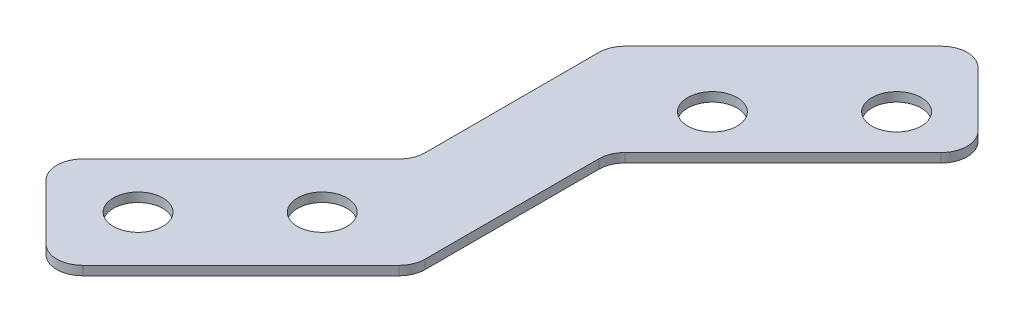
ISO-10303-21;
HEADER;
FILE_DESCRIPTION(('STEP AP214'),'2;1');
FILE_NAME('part.step','',(''),(''),'','','');
FILE_SCHEMA(('AUTOMOTIVE_DESIGN { 1 0 10303 214 1 1 1 1 }'));
ENDSEC;
DATA;
#1=APPLICATION_CONTEXT('core data for automotive mechanical design processes');
#2=APPLICATION_PROTOCOL_DEFINITION('international standard','automotive_design',2000,#1);
#3=PRODUCT_CONTEXT('',#1,'mechanical');
#4=PRODUCT('Part','Part','',(#3));
#5=PRODUCT_RELATED_PRODUCT_CATEGORY('part','',(#4));
#6=PRODUCT_DEFINITION_FORMATION('','',#4);
#7=PRODUCT_DEFINITION_CONTEXT('part definition',#1,'design');
#8=PRODUCT_DEFINITION('design','',#6,#7);
#9=PRODUCT_DEFINITION_SHAPE('','',#8);
#10=(LENGTH_UNIT() NAMED_UNIT(*) SI_UNIT(.MILLI.,.METRE.));
#11=(NAMED_UNIT(*) PLANE_ANGLE_UNIT() SI_UNIT($,.RADIAN.));
#12=(NAMED_UNIT(*) SI_UNIT($,.STERADIAN.) SOLID_ANGLE_UNIT());
#13=UNCERTAINTY_MEASURE_WITH_UNIT(LENGTH_MEASURE(1.E-05),#10,'distance_accuracy_value','');
#14=(GEOMETRIC_REPRESENTATION_CONTEXT(3) GLOBAL_UNCERTAINTY_ASSIGNED_CONTEXT((#13)) GLOBAL_UNIT_ASSIGNED_CONTEXT((#10,
#11,#12)) REPRESENTATION_CONTEXT('',''));
#15=CARTESIAN_POINT('',(0.,0.,0.));
#16=DIRECTION('',(0.,0.,1.));
#17=DIRECTION('',(1.,0.,0.));
#18=AXIS2_PLACEMENT_3D('',#15,#16,#17);
#19=CARTESIAN_POINT('',(-14.142135623731,-0.7,14.1421356237309));
#20=DIRECTION('',(0.707106781186547,0.,0.707106781186549));
#21=DIRECTION('',(0.707106781186549,0.,-0.707106781186547));
#22=AXIS2_PLACEMENT_3D('',#19,#20,#21);
#23=PLANE('',#22);
#24=DIRECTION('',(0.707106781186548,0.,-0.707106781186546));
#25=VECTOR('',#24,1.);
#26=CARTESIAN_POINT('',(-14.142135623731,-0.7,14.1421356237309));
#27=LINE('',#26,#25);
#28=CARTESIAN_POINT('',(-12.7279220613579,-0.7,12.7279220613578));
#29=VERTEX_POINT('',#28);
#30=CARTESIAN_POINT('',(-0.585786437626905,-0.7,0.585786437626903));
#31=VERTEX_POINT('',#30);
#32=EDGE_CURVE('E255',#29,#31,#27,.T.);
#33=ORIENTED_EDGE('',*,*,#32,.T.);
#34=DIRECTION('',(0.,1.,0.));
#35=VECTOR('',#34,1.);
#36=CARTESIAN_POINT('',(-0.585786437626903,-0.7,0.585786437626901));
#37=LINE('',#36,#35);
#38=CARTESIAN_POINT('',(-0.585786437626905,0.,0.585786437626903));
#39=VERTEX_POINT('',#38);
#40=EDGE_CURVE('E230',#31,#39,#37,.T.);
#41=ORIENTED_EDGE('',*,*,#40,.T.);
#42=DIRECTION('',(0.707106781186548,0.,-0.707106781186546));
#43=VECTOR('',#42,1.);
#44=CARTESIAN_POINT('',(-14.142135623731,0.,14.1421356237309));
#45=LINE('',#44,#43);
#46=CARTESIAN_POINT('',(-12.7279220613579,0.,12.7279220613578));
#47=VERTEX_POINT('',#46);
#48=EDGE_CURVE('E272',#47,#39,#45,.T.);
#49=ORIENTED_EDGE('',*,*,#48,.F.);
#50=DIRECTION('',(0.,1.,0.));
#51=VECTOR('',#50,1.);
#52=CARTESIAN_POINT('',(-12.7279220613579,-0.7,12.7279220613578));
#53=LINE('',#52,#51);
#54=EDGE_CURVE('E228',#47,#29,#53,.F.);
#55=ORIENTED_EDGE('',*,*,#54,.T.);
#56=EDGE_LOOP('',(#33,#41,#49,#55));
#57=FACE_BOUND('',#56,.T.);
#58=ADVANCED_FACE('F37',(#57),#23,.T.);
#59=CARTESIAN_POINT('',(-14.142135623731,-0.7,14.1421356237309));
#60=DIRECTION('',(-0.707106781186549,0.,0.707106781186547));
#61=DIRECTION('',(0.707106781186547,0.,0.707106781186549));
#62=AXIS2_PLACEMENT_3D('',#59,#60,#61);
#63=PLANE('',#62);
#64=DIRECTION('',(0.707106781186546,0.,0.707106781186548));
#65=VECTOR('',#64,1.);
#66=CARTESIAN_POINT('',(-14.142135623731,0.,14.1421356237309));
#67=LINE('',#66,#65);
#68=CARTESIAN_POINT('',(-19.7989898732233,0.,8.48528137423854));
#69=VERTEX_POINT('',#68);
#70=CARTESIAN_POINT('',(-15.5563491861041,0.,12.7279220613578));
#71=VERTEX_POINT('',#70);
#72=EDGE_CURVE('E184',#69,#71,#67,.T.);
#73=ORIENTED_EDGE('',*,*,#72,.F.);
#74=DIRECTION('',(0.,1.,0.));
#75=VECTOR('',#74,1.);
#76=CARTESIAN_POINT('',(-19.7989898732233,-0.7,8.48528137423854));
#77=LINE('',#76,#75);
#78=CARTESIAN_POINT('',(-19.7989898732233,-0.7,8.48528137423854));
#79=VERTEX_POINT('',#78);
#80=EDGE_CURVE('E236',#69,#79,#77,.F.);
#81=ORIENTED_EDGE('',*,*,#80,.T.);
#82=DIRECTION('',(0.707106781186546,0.,0.707106781186548));
#83=VECTOR('',#82,1.);
#84=CARTESIAN_POINT('',(-14.142135623731,-0.7,14.1421356237309));
#85=LINE('',#84,#83);
#86=CARTESIAN_POINT('',(-15.5563491861041,-0.7,12.7279220613578));
#87=VERTEX_POINT('',#86);
#88=EDGE_CURVE('E176',#79,#87,#85,.T.);
#89=ORIENTED_EDGE('',*,*,#88,.T.);
#90=DIRECTION('',(0.,1.,0.));
#91=VECTOR('',#90,1.);
#92=CARTESIAN_POINT('',(-15.5563491861041,-0.7,12.7279220613578));
#93=LINE('',#92,#91);
#94=EDGE_CURVE('E233',#87,#71,#93,.T.);
#95=ORIENTED_EDGE('',*,*,#94,.T.);
#96=EDGE_LOOP('',(#73,#81,#89,#95));
#97=FACE_BOUND('',#96,.T.);
#98=ADVANCED_FACE('F289',(#97),#63,.T.);
#99=CARTESIAN_POINT('',(-7.07106781186548,-0.7,-7.07106781186546));
#100=DIRECTION('',(-0.707106781186547,0.,-0.707106781186548));
#101=DIRECTION('',(-0.707106781186548,0.,0.707106781186547));
#102=AXIS2_PLACEMENT_3D('',#99,#100,#101);
#103=PLANE('',#102);
#104=DIRECTION('',(-0.707106781186549,0.,0.707106781186547));
#105=VECTOR('',#104,1.);
#106=CARTESIAN_POINT('',(-7.07106781186548,0.,-7.07106781186546));
#107=LINE('',#106,#105);
#108=CARTESIAN_POINT('',(-7.65685424949239,0.,-6.48528137423856));
#109=VERTEX_POINT('',#108);
#110=CARTESIAN_POINT('',(-19.7989898732233,0.,5.65685424949236));
#111=VERTEX_POINT('',#110);
#112=EDGE_CURVE('E281',#109,#111,#107,.T.);
#113=ORIENTED_EDGE('',*,*,#112,.F.);
#114=DIRECTION('',(0.,1.,0.));
#115=VECTOR('',#114,1.);
#116=CARTESIAN_POINT('',(-7.65685424949239,-0.7,-6.48528137423856));
#117=LINE('',#116,#115);
#118=CARTESIAN_POINT('',(-7.65685424949239,-0.7,-6.48528137423856));
#119=VERTEX_POINT('',#118);
#120=EDGE_CURVE('E222',#109,#119,#117,.F.);
#121=ORIENTED_EDGE('',*,*,#120,.T.);
#122=DIRECTION('',(-0.707106781186549,0.,0.707106781186547));
#123=VECTOR('',#122,1.);
#124=CARTESIAN_POINT('',(-7.07106781186548,-0.7,-7.07106781186546));
#125=LINE('',#124,#123);
#126=CARTESIAN_POINT('',(-19.7989898732233,-0.7,5.65685424949236));
#127=VERTEX_POINT('',#126);
#128=EDGE_CURVE('E181',#119,#127,#125,.T.);
#129=ORIENTED_EDGE('',*,*,#128,.T.);
#130=DIRECTION('',(0.,1.,0.));
#131=VECTOR('',#130,1.);
#132=CARTESIAN_POINT('',(-19.7989898732233,-0.7,5.65685424949236));
#133=LINE('',#132,#131);
#134=EDGE_CURVE('E219',#127,#111,#133,.T.);
#135=ORIENTED_EDGE('',*,*,#134,.T.);
#136=EDGE_LOOP('',(#113,#121,#129,#135));
#137=FACE_BOUND('',#136,.T.);
#138=ADVANCED_FACE('F301',(#137),#103,.T.);
#139=CARTESIAN_POINT('',(-7.07106781186552,-0.7,-22.0710678118655));
#140=DIRECTION('',(-1.,0.,0.));
#141=DIRECTION('',(0.,0.,1.));
#142=AXIS2_PLACEMENT_3D('',#139,#140,#141);
#143=PLANE('',#142);
#144=DIRECTION('',(0.,0.,1.));
#145=VECTOR('',#144,1.);
#146=CARTESIAN_POINT('',(-7.07106781186552,-0.7,-22.0710678118655));
#147=LINE('',#146,#145);
#148=CARTESIAN_POINT('',(-7.07106781186551,-0.7,-21.2426406871193));
#149=VERTEX_POINT('',#148);
#150=CARTESIAN_POINT('',(-7.07106781186548,-0.7,-7.89949493661166));
#151=VERTEX_POINT('',#150);
#152=EDGE_CURVE('E267',#149,#151,#147,.T.);
#153=ORIENTED_EDGE('',*,*,#152,.T.);
#154=DIRECTION('',(0.,1.,0.));
#155=VECTOR('',#154,1.);
#156=CARTESIAN_POINT('',(-7.07106781186548,0.,-7.89949493661166));
#157=LINE('',#156,#155);
#158=CARTESIAN_POINT('',(-7.07106781186548,0.,-7.89949493661166));
#159=VERTEX_POINT('',#158);
#160=EDGE_CURVE('E216',#151,#159,#157,.T.);
#161=ORIENTED_EDGE('',*,*,#160,.T.);
#162=DIRECTION('',(0.,0.,1.));
#163=VECTOR('',#162,1.);
#164=CARTESIAN_POINT('',(-7.07106781186552,0.,-22.0710678118655));
#165=LINE('',#164,#163);
#166=CARTESIAN_POINT('',(-7.07106781186551,0.,-21.2426406871193));
#167=VERTEX_POINT('',#166);
#168=EDGE_CURVE('E279',#167,#159,#165,.T.);
#169=ORIENTED_EDGE('',*,*,#168,.F.);
#170=DIRECTION('',(0.,1.,0.));
#171=VECTOR('',#170,1.);
#172=CARTESIAN_POINT('',(-7.07106781186551,-0.7,-21.2426406871193));
#173=LINE('',#172,#171);
#174=EDGE_CURVE('E214',#167,#149,#173,.F.);
#175=ORIENTED_EDGE('',*,*,#174,.T.);
#176=EDGE_LOOP('',(#153,#161,#169,#175));
#177=FACE_BOUND('',#176,.T.);
#178=ADVANCED_FACE('F309',(#177),#143,.T.);
#179=CARTESIAN_POINT('',(7.07106781186552,-0.7,-36.2132034355964));
#180=DIRECTION('',(-0.707106781186543,0.,-0.707106781186552));
#181=DIRECTION('',(-0.707106781186552,0.,0.707106781186543));
#182=AXIS2_PLACEMENT_3D('',#179,#180,#181);
#183=PLANE('',#182);
#184=DIRECTION('',(-0.707106781186552,0.,0.707106781186543));
#185=VECTOR('',#184,1.);
#186=CARTESIAN_POINT('',(7.07106781186552,0.,-36.2132034355964));
#187=LINE('',#186,#185);
#188=CARTESIAN_POINT('',(5.65685424949242,0.,-34.7989898732233));
#189=VERTEX_POINT('',#188);
#190=CARTESIAN_POINT('',(-6.4852813742386,0.,-22.6568542494925));
#191=VERTEX_POINT('',#190);
#192=EDGE_CURVE('E171',#189,#191,#187,.T.);
#193=ORIENTED_EDGE('',*,*,#192,.F.);
#194=DIRECTION('',(0.,1.,0.));
#195=VECTOR('',#194,1.);
#196=CARTESIAN_POINT('',(5.65685424949242,-0.7,-34.7989898732233));
#197=LINE('',#196,#195);
#198=CARTESIAN_POINT('',(5.65685424949242,-0.7,-34.7989898732233));
#199=VERTEX_POINT('',#198);
#200=EDGE_CURVE('E197',#189,#199,#197,.F.);
#201=ORIENTED_EDGE('',*,*,#200,.T.);
#202=DIRECTION('',(-0.707106781186552,0.,0.707106781186543));
#203=VECTOR('',#202,1.);
#204=CARTESIAN_POINT('',(7.07106781186552,-0.7,-36.2132034355964));
#205=LINE('',#204,#203);
#206=CARTESIAN_POINT('',(-6.4852813742386,-0.7,-22.6568542494925));
#207=VERTEX_POINT('',#206);
#208=EDGE_CURVE('E264',#199,#207,#205,.T.);
#209=ORIENTED_EDGE('',*,*,#208,.T.);
#210=DIRECTION('',(0.,1.,0.));
#211=VECTOR('',#210,1.);
#212=CARTESIAN_POINT('',(-6.4852813742386,-0.7,-22.6568542494925));
#213=LINE('',#212,#211);
#214=EDGE_CURVE('E194',#207,#191,#213,.T.);
#215=ORIENTED_EDGE('',*,*,#214,.T.);
#216=EDGE_LOOP('',(#193,#201,#209,#215));
#217=FACE_BOUND('',#216,.T.);
#218=ADVANCED_FACE('F318',(#217),#183,.T.);
#219=CARTESIAN_POINT('',(14.142135623731,-0.7,-29.1421356237309));
#220=DIRECTION('',(0.707106781186549,0.,-0.707106781186546));
#221=DIRECTION('',(-0.707106781186546,0.,-0.707106781186549));
#222=AXIS2_PLACEMENT_3D('',#219,#220,#221);
#223=PLANE('',#222);
#224=DIRECTION('',(-0.707106781186546,0.,-0.707106781186549));
#225=VECTOR('',#224,1.);
#226=CARTESIAN_POINT('',(14.142135623731,-0.7,-29.1421356237309));
#227=LINE('',#226,#225);
#228=CARTESIAN_POINT('',(12.7279220613579,-0.7,-30.556349186104));
#229=VERTEX_POINT('',#228);
#230=CARTESIAN_POINT('',(8.4852813742386,-0.7,-34.7989898732233));
#231=VERTEX_POINT('',#230);
#232=EDGE_CURVE('E257',#229,#231,#227,.T.);
#233=ORIENTED_EDGE('',*,*,#232,.T.);
#234=DIRECTION('',(0.,1.,0.));
#235=VECTOR('',#234,1.);
#236=CARTESIAN_POINT('',(8.48528137423861,-0.7,-34.7989898732233));
#237=LINE('',#236,#235);
#238=CARTESIAN_POINT('',(8.4852813742386,0.,-34.7989898732233));
#239=VERTEX_POINT('',#238);
#240=EDGE_CURVE('E170',#231,#239,#237,.T.);
#241=ORIENTED_EDGE('',*,*,#240,.T.);
#242=DIRECTION('',(-0.707106781186546,0.,-0.707106781186549));
#243=VECTOR('',#242,1.);
#244=CARTESIAN_POINT('',(14.142135623731,0.,-29.1421356237309));
#245=LINE('',#244,#243);
#246=CARTESIAN_POINT('',(12.7279220613579,0.,-30.556349186104));
#247=VERTEX_POINT('',#246);
#248=EDGE_CURVE('E153',#247,#239,#245,.T.);
#249=ORIENTED_EDGE('',*,*,#248,.F.);
#250=DIRECTION('',(0.,1.,0.));
#251=VECTOR('',#250,1.);
#252=CARTESIAN_POINT('',(12.7279220613579,-0.7,-30.556349186104));
#253=LINE('',#252,#251);
#254=EDGE_CURVE('E167',#247,#229,#253,.F.);
#255=ORIENTED_EDGE('',*,*,#254,.T.);
#256=EDGE_LOOP('',(#233,#241,#249,#255));
#257=FACE_BOUND('',#256,.T.);
#258=ADVANCED_FACE('F166',(#257),#223,.T.);
#259=CARTESIAN_POINT('',(0.,-0.7,-15.));
#260=DIRECTION('',(0.707106781186547,0.,0.707106781186549));
#261=DIRECTION('',(0.707106781186549,0.,-0.707106781186547));
#262=AXIS2_PLACEMENT_3D('',#259,#260,#261);
#263=PLANE('',#262);
#264=DIRECTION('',(0.707106781186549,0.,-0.707106781186546));
#265=VECTOR('',#264,1.);
#266=CARTESIAN_POINT('',(0.,-0.7,-15.));
#267=LINE('',#266,#265);
#268=CARTESIAN_POINT('',(0.585786437626906,-0.7,-15.5857864376269));
#269=VERTEX_POINT('',#268);
#270=CARTESIAN_POINT('',(12.7279220613579,-0.7,-27.7279220613578));
#271=VERTEX_POINT('',#270);
#272=EDGE_CURVE('E254',#269,#271,#267,.T.);
#273=ORIENTED_EDGE('',*,*,#272,.T.);
#274=DIRECTION('',(0.,1.,0.));
#275=VECTOR('',#274,1.);
#276=CARTESIAN_POINT('',(12.7279220613579,-0.7,-27.7279220613578));
#277=LINE('',#276,#275);
#278=CARTESIAN_POINT('',(12.7279220613579,0.,-27.7279220613578));
#279=VERTEX_POINT('',#278);
#280=EDGE_CURVE('E212',#271,#279,#277,.T.);
#281=ORIENTED_EDGE('',*,*,#280,.T.);
#282=DIRECTION('',(0.707106781186549,0.,-0.707106781186546));
#283=VECTOR('',#282,1.);
#284=CARTESIAN_POINT('',(0.,0.,-15.));
#285=LINE('',#284,#283);
#286=CARTESIAN_POINT('',(0.585786437626906,0.,-15.5857864376269));
#287=VERTEX_POINT('',#286);
#288=EDGE_CURVE('E155',#287,#279,#285,.T.);
#289=ORIENTED_EDGE('',*,*,#288,.F.);
#290=DIRECTION('',(0.,1.,0.));
#291=VECTOR('',#290,1.);
#292=CARTESIAN_POINT('',(0.585786437626907,-0.7,-15.5857864376269));
#293=LINE('',#292,#291);
#294=EDGE_CURVE('E210',#287,#269,#293,.F.);
#295=ORIENTED_EDGE('',*,*,#294,.T.);
#296=EDGE_LOOP('',(#273,#281,#289,#295));
#297=FACE_BOUND('',#296,.T.);
#298=ADVANCED_FACE('F248',(#297),#263,.T.);
#299=CARTESIAN_POINT('',(0.,-0.7,0.));
#300=DIRECTION('',(1.,0.,0.));
#301=DIRECTION('',(0.,0.,-1.));
#302=AXIS2_PLACEMENT_3D('',#299,#300,#301);
#303=PLANE('',#302);
#304=DIRECTION('',(0.,0.,-1.));
#305=VECTOR('',#304,1.);
#306=CARTESIAN_POINT('',(0.,-0.7,0.));
#307=LINE('',#306,#305);
#308=CARTESIAN_POINT('',(0.,-0.7,-0.828427124746194));
#309=VERTEX_POINT('',#308);
#310=CARTESIAN_POINT('',(0.,-0.7,-14.1715728752538));
#311=VERTEX_POINT('',#310);
#312=EDGE_CURVE('E252',#309,#311,#307,.T.);
#313=ORIENTED_EDGE('',*,*,#312,.T.);
#314=DIRECTION('',(0.,1.,0.));
#315=VECTOR('',#314,1.);
#316=CARTESIAN_POINT('',(0.,0.,-14.1715728752538));
#317=LINE('',#316,#315);
#318=CARTESIAN_POINT('',(0.,0.,-14.1715728752538));
#319=VERTEX_POINT('',#318);
#320=EDGE_CURVE('E225',#311,#319,#317,.T.);
#321=ORIENTED_EDGE('',*,*,#320,.T.);
#322=DIRECTION('',(0.,0.,-1.));
#323=VECTOR('',#322,1.);
#324=CARTESIAN_POINT('',(0.,0.,0.));
#325=LINE('',#324,#323);
#326=CARTESIAN_POINT('',(0.,0.,-0.828427124746194));
#327=VERTEX_POINT('',#326);
#328=EDGE_CURVE('E242',#327,#319,#325,.T.);
#329=ORIENTED_EDGE('',*,*,#328,.F.);
#330=DIRECTION('',(0.,1.,0.));
#331=VECTOR('',#330,1.);
#332=CARTESIAN_POINT('',(0.,-0.7,-0.828427124746194));
#333=LINE('',#332,#331);
#334=EDGE_CURVE('E57',#327,#309,#333,.F.);
#335=ORIENTED_EDGE('',*,*,#334,.T.);
#336=EDGE_LOOP('',(#313,#321,#329,#335));
#337=FACE_BOUND('',#336,.T.);
#338=ADVANCED_FACE('F251',(#337),#303,.T.);
#339=CARTESIAN_POINT('',(0.,-0.7,0.));
#340=DIRECTION('',(0.,1.,0.));
#341=DIRECTION('',(0.,0.,1.));
#342=AXIS2_PLACEMENT_3D('',#339,#340,#341);
#343=PLANE('',#342);
#344=CARTESIAN_POINT('',(-14.1398215405069,-0.699999999999999,7.07338189508951));
#345=DIRECTION('',(0.,1.,0.));
#346=DIRECTION('',(0.,0.,1.));
#347=AXIS2_PLACEMENT_3D('',#344,#345,#346);
#348=CIRCLE('',#347,1.89864999999999);
#349=CARTESIAN_POINT('',(-14.1398215405069,-0.699999999999999,8.9720318950895));
#350=VERTEX_POINT('',#349);
#351=EDGE_CURVE('E379',#350,#350,#348,.T.);
#352=ORIENTED_EDGE('',*,*,#351,.T.);
#353=EDGE_LOOP('',(#352));
#354=FACE_BOUND('',#353,.T.);
#355=CARTESIAN_POINT('',(-7.06875372864142,-0.699999999999999,0.00231408322403509));
#356=DIRECTION('',(0.,1.,0.));
#357=DIRECTION('',(0.,0.,1.));
#358=AXIS2_PLACEMENT_3D('',#355,#356,#357);
#359=CIRCLE('',#358,1.89864999999999);
#360=CARTESIAN_POINT('',(-7.06875372864142,-0.699999999999999,1.90096408322403));
#361=VERTEX_POINT('',#360);
#362=EDGE_CURVE('E374',#361,#361,#359,.T.);
#363=ORIENTED_EDGE('',*,*,#362,.T.);
#364=EDGE_LOOP('',(#363));
#365=FACE_BOUND('',#364,.T.);
#366=CARTESIAN_POINT('',(1.23743686707646,-0.699999999999999,-21.6538748109654));
#367=DIRECTION('',(0.,1.,0.));
#368=DIRECTION('',(0.,0.,1.));
#369=AXIS2_PLACEMENT_3D('',#366,#367,#368);
#370=CIRCLE('',#369,1.89864999999999);
#371=CARTESIAN_POINT('',(1.23743686707646,-0.699999999999999,-19.7552248109654));
#372=VERTEX_POINT('',#371);
#373=EDGE_CURVE('E390',#372,#372,#370,.T.);
#374=ORIENTED_EDGE('',*,*,#373,.T.);
#375=EDGE_LOOP('',(#374));
#376=FACE_BOUND('',#375,.T.);
#377=CARTESIAN_POINT('',(8.30850467894193,-0.699999999999999,-28.7249426228309));
#378=DIRECTION('',(0.,1.,0.));
#379=DIRECTION('',(0.,0.,1.));
#380=AXIS2_PLACEMENT_3D('',#377,#378,#379);
#381=CIRCLE('',#380,1.89864999999999);
#382=CARTESIAN_POINT('',(8.30850467894193,-0.699999999999999,-26.8262926228309));
#383=VERTEX_POINT('',#382);
#384=EDGE_CURVE('E275',#383,#383,#381,.T.);
#385=ORIENTED_EDGE('',*,*,#384,.T.);
#386=EDGE_LOOP('',(#385));
#387=FACE_BOUND('',#386,.T.);
#388=ORIENTED_EDGE('',*,*,#208,.F.);
#389=CARTESIAN_POINT('',(7.07106781186551,-0.7,-33.3847763108502));
#390=DIRECTION('',(0.,1.,0.));
#391=DIRECTION('',(0.,0.,1.));
#392=AXIS2_PLACEMENT_3D('',#389,#390,#391);
#393=CIRCLE('',#392,2.);
#394=EDGE_CURVE('E208',#199,#231,#393,.F.);
#395=ORIENTED_EDGE('',*,*,#394,.T.);
#396=ORIENTED_EDGE('',*,*,#232,.F.);
#397=CARTESIAN_POINT('',(11.3137084989848,-0.7,-29.1421356237309));
#398=DIRECTION('',(0.,1.,0.));
#399=DIRECTION('',(0.,0.,1.));
#400=AXIS2_PLACEMENT_3D('',#397,#398,#399);
#401=CIRCLE('',#400,2.);
#402=EDGE_CURVE('E175',#229,#271,#401,.F.);
#403=ORIENTED_EDGE('',*,*,#402,.T.);
#404=ORIENTED_EDGE('',*,*,#272,.F.);
#405=CARTESIAN_POINT('',(2.,-0.7,-14.1715728752538));
#406=DIRECTION('',(0.,1.,0.));
#407=DIRECTION('',(0.,0.,1.));
#408=AXIS2_PLACEMENT_3D('',#405,#406,#407);
#409=CIRCLE('',#408,2.);
#410=EDGE_CURVE('E11',#269,#311,#409,.T.);
#411=ORIENTED_EDGE('',*,*,#410,.T.);
#412=ORIENTED_EDGE('',*,*,#312,.F.);
#413=CARTESIAN_POINT('',(-2.,-0.7,-0.828427124746194));
#414=DIRECTION('',(0.,1.,0.));
#415=DIRECTION('',(0.,0.,1.));
#416=AXIS2_PLACEMENT_3D('',#413,#414,#415);
#417=CIRCLE('',#416,2.);
#418=EDGE_CURVE('E203',#309,#31,#417,.F.);
#419=ORIENTED_EDGE('',*,*,#418,.T.);
#420=ORIENTED_EDGE('',*,*,#32,.F.);
#421=CARTESIAN_POINT('',(-14.142135623731,-0.7,11.3137084989847));
#422=DIRECTION('',(0.,1.,0.));
#423=DIRECTION('',(0.,0.,1.));
#424=AXIS2_PLACEMENT_3D('',#421,#422,#423);
#425=CIRCLE('',#424,2.);
#426=EDGE_CURVE('E199',#29,#87,#425,.F.);
#427=ORIENTED_EDGE('',*,*,#426,.T.);
#428=ORIENTED_EDGE('',*,*,#88,.F.);
#429=CARTESIAN_POINT('',(-18.3847763108502,-0.7,7.07106781186545));
#430=DIRECTION('',(0.,1.,0.));
#431=DIRECTION('',(0.,0.,1.));
#432=AXIS2_PLACEMENT_3D('',#429,#430,#431);
#433=CIRCLE('',#432,2.);
#434=EDGE_CURVE('E201',#79,#127,#433,.F.);
#435=ORIENTED_EDGE('',*,*,#434,.T.);
#436=ORIENTED_EDGE('',*,*,#128,.F.);
#437=CARTESIAN_POINT('',(-9.07106781186548,-0.7,-7.89949493661165));
#438=DIRECTION('',(0.,1.,0.));
#439=DIRECTION('',(0.,0.,1.));
#440=AXIS2_PLACEMENT_3D('',#437,#438,#439);
#441=CIRCLE('',#440,2.);
#442=EDGE_CURVE('E240',#119,#151,#441,.T.);
#443=ORIENTED_EDGE('',*,*,#442,.T.);
#444=ORIENTED_EDGE('',*,*,#152,.F.);
#445=CARTESIAN_POINT('',(-5.07106781186552,-0.7,-21.2426406871193));
#446=DIRECTION('',(0.,1.,0.));
#447=DIRECTION('',(0.,0.,1.));
#448=AXIS2_PLACEMENT_3D('',#445,#446,#447);
#449=CIRCLE('',#448,2.);
#450=EDGE_CURVE('E205',#149,#207,#449,.F.);
#451=ORIENTED_EDGE('',*,*,#450,.T.);
#452=EDGE_LOOP('',(#388,#395,#396,#403,#404,#411,#412,#419,#420,#427,#428,#435,#436,#443,#444,#451));
#453=FACE_BOUND('',#452,.T.);
#454=ADVANCED_FACE('F298',(#354,#365,#376,#387,#453),#343,.F.);
#455=CARTESIAN_POINT('',(0.,0.,0.));
#456=DIRECTION('',(0.,1.,0.));
#457=DIRECTION('',(0.,0.,1.));
#458=AXIS2_PLACEMENT_3D('',#455,#456,#457);
#459=PLANE('',#458);
#460=CARTESIAN_POINT('',(-14.1398215405069,0.,7.07338189508951));
#461=DIRECTION('',(0.,1.,0.));
#462=DIRECTION('',(0.,0.,1.));
#463=AXIS2_PLACEMENT_3D('',#460,#461,#462);
#464=CIRCLE('',#463,1.89864999999999);
#465=CARTESIAN_POINT('',(-14.1398215405069,0.,8.9720318950895));
#466=VERTEX_POINT('',#465);
#467=EDGE_CURVE('E384',#466,#466,#464,.T.);
#468=ORIENTED_EDGE('',*,*,#467,.F.);
#469=EDGE_LOOP('',(#468));
#470=FACE_BOUND('',#469,.T.);
#471=CARTESIAN_POINT('',(-7.06875372864142,0.,0.00231408322403509));
#472=DIRECTION('',(0.,1.,0.));
#473=DIRECTION('',(0.,0.,1.));
#474=AXIS2_PLACEMENT_3D('',#471,#472,#473);
#475=CIRCLE('',#474,1.89864999999999);
#476=CARTESIAN_POINT('',(-7.06875372864142,0.,1.90096408322402));
#477=VERTEX_POINT('',#476);
#478=EDGE_CURVE('E377',#477,#477,#475,.T.);
#479=ORIENTED_EDGE('',*,*,#478,.F.);
#480=EDGE_LOOP('',(#479));
#481=FACE_BOUND('',#480,.T.);
#482=CARTESIAN_POINT('',(1.23743686707646,0.,-21.6538748109654));
#483=DIRECTION('',(0.,1.,0.));
#484=DIRECTION('',(0.,0.,1.));
#485=AXIS2_PLACEMENT_3D('',#482,#483,#484);
#486=CIRCLE('',#485,1.89864999999999);
#487=CARTESIAN_POINT('',(1.23743686707646,0.,-19.7552248109654));
#488=VERTEX_POINT('',#487);
#489=EDGE_CURVE('E381',#488,#488,#486,.T.);
#490=ORIENTED_EDGE('',*,*,#489,.F.);
#491=EDGE_LOOP('',(#490));
#492=FACE_BOUND('',#491,.T.);
#493=CARTESIAN_POINT('',(8.30850467894193,0.,-28.7249426228309));
#494=DIRECTION('',(0.,1.,0.));
#495=DIRECTION('',(0.,0.,1.));
#496=AXIS2_PLACEMENT_3D('',#493,#494,#495);
#497=CIRCLE('',#496,1.89864999999999);
#498=CARTESIAN_POINT('',(8.30850467894193,0.,-26.8262926228309));
#499=VERTEX_POINT('',#498);
#500=EDGE_CURVE('E393',#499,#499,#497,.T.);
#501=ORIENTED_EDGE('',*,*,#500,.F.);
#502=EDGE_LOOP('',(#501));
#503=FACE_BOUND('',#502,.T.);
#504=ORIENTED_EDGE('',*,*,#248,.T.);
#505=CARTESIAN_POINT('',(7.07106781186551,0.,-33.3847763108502));
#506=DIRECTION('',(0.,1.,0.));
#507=DIRECTION('',(0.,0.,1.));
#508=AXIS2_PLACEMENT_3D('',#505,#506,#507);
#509=CIRCLE('',#508,2.);
#510=EDGE_CURVE('E160',#239,#189,#509,.T.);
#511=ORIENTED_EDGE('',*,*,#510,.T.);
#512=ORIENTED_EDGE('',*,*,#192,.T.);
#513=CARTESIAN_POINT('',(-5.07106781186552,0.,-21.2426406871193));
#514=DIRECTION('',(0.,1.,0.));
#515=DIRECTION('',(0.,0.,1.));
#516=AXIS2_PLACEMENT_3D('',#513,#514,#515);
#517=CIRCLE('',#516,2.);
#518=EDGE_CURVE('E161',#191,#167,#517,.T.);
#519=ORIENTED_EDGE('',*,*,#518,.T.);
#520=ORIENTED_EDGE('',*,*,#168,.T.);
#521=CARTESIAN_POINT('',(-9.07106781186548,0.,-7.89949493661165));
#522=DIRECTION('',(0.,1.,0.));
#523=DIRECTION('',(0.,0.,1.));
#524=AXIS2_PLACEMENT_3D('',#521,#522,#523);
#525=CIRCLE('',#524,2.);
#526=EDGE_CURVE('E238',#159,#109,#525,.F.);
#527=ORIENTED_EDGE('',*,*,#526,.T.);
#528=ORIENTED_EDGE('',*,*,#112,.T.);
#529=CARTESIAN_POINT('',(-18.3847763108502,0.,7.07106781186545));
#530=DIRECTION('',(0.,1.,0.));
#531=DIRECTION('',(0.,0.,1.));
#532=AXIS2_PLACEMENT_3D('',#529,#530,#531);
#533=CIRCLE('',#532,2.);
#534=EDGE_CURVE('E188',#111,#69,#533,.T.);
#535=ORIENTED_EDGE('',*,*,#534,.T.);
#536=ORIENTED_EDGE('',*,*,#72,.T.);
#537=CARTESIAN_POINT('',(-14.142135623731,0.,11.3137084989847));
#538=DIRECTION('',(0.,1.,0.));
#539=DIRECTION('',(0.,0.,1.));
#540=AXIS2_PLACEMENT_3D('',#537,#538,#539);
#541=CIRCLE('',#540,2.);
#542=EDGE_CURVE('E178',#71,#47,#541,.T.);
#543=ORIENTED_EDGE('',*,*,#542,.T.);
#544=ORIENTED_EDGE('',*,*,#48,.T.);
#545=CARTESIAN_POINT('',(-2.,0.,-0.828427124746194));
#546=DIRECTION('',(0.,1.,0.));
#547=DIRECTION('',(0.,0.,1.));
#548=AXIS2_PLACEMENT_3D('',#545,#546,#547);
#549=CIRCLE('',#548,2.);
#550=EDGE_CURVE('E190',#39,#327,#549,.T.);
#551=ORIENTED_EDGE('',*,*,#550,.T.);
#552=ORIENTED_EDGE('',*,*,#328,.T.);
#553=CARTESIAN_POINT('',(2.,0.,-14.1715728752538));
#554=DIRECTION('',(0.,1.,0.));
#555=DIRECTION('',(0.,0.,1.));
#556=AXIS2_PLACEMENT_3D('',#553,#554,#555);
#557=CIRCLE('',#556,2.);
#558=EDGE_CURVE('E45',#319,#287,#557,.F.);
#559=ORIENTED_EDGE('',*,*,#558,.T.);
#560=ORIENTED_EDGE('',*,*,#288,.T.);
#561=CARTESIAN_POINT('',(11.3137084989848,0.,-29.1421356237309));
#562=DIRECTION('',(0.,1.,0.));
#563=DIRECTION('',(0.,0.,1.));
#564=AXIS2_PLACEMENT_3D('',#561,#562,#563);
#565=CIRCLE('',#564,2.);
#566=EDGE_CURVE('E150',#279,#247,#565,.T.);
#567=ORIENTED_EDGE('',*,*,#566,.T.);
#568=EDGE_LOOP('',(#504,#511,#512,#519,#520,#527,#528,#535,#536,#543,#544,#551,#552,#559,#560,#567));
#569=FACE_BOUND('',#568,.T.);
#570=ADVANCED_FACE('F152',(#470,#481,#492,#503,#569),#459,.T.);
#571=CARTESIAN_POINT('',(8.30850467894193,0.,-28.7249426228309));
#572=DIRECTION('',(0.,1.,0.));
#573=DIRECTION('',(0.,0.,1.));
#574=AXIS2_PLACEMENT_3D('',#571,#572,#573);
#575=CYLINDRICAL_SURFACE('',#574,1.89864999999999);
#576=ORIENTED_EDGE('',*,*,#384,.F.);
#577=EDGE_LOOP('',(#576));
#578=FACE_BOUND('',#577,.T.);
#579=ORIENTED_EDGE('',*,*,#500,.T.);
#580=EDGE_LOOP('',(#579));
#581=FACE_BOUND('',#580,.T.);
#582=ADVANCED_FACE('F355',(#578,#581),#575,.F.);
#583=CARTESIAN_POINT('',(1.23743686707646,0.,-21.6538748109654));
#584=DIRECTION('',(0.,1.,0.));
#585=DIRECTION('',(0.,0.,1.));
#586=AXIS2_PLACEMENT_3D('',#583,#584,#585);
#587=CYLINDRICAL_SURFACE('',#586,1.89864999999999);
#588=ORIENTED_EDGE('',*,*,#373,.F.);
#589=EDGE_LOOP('',(#588));
#590=FACE_BOUND('',#589,.T.);
#591=ORIENTED_EDGE('',*,*,#489,.T.);
#592=EDGE_LOOP('',(#591));
#593=FACE_BOUND('',#592,.T.);
#594=ADVANCED_FACE('F362',(#590,#593),#587,.F.);
#595=CARTESIAN_POINT('',(-7.06875372864142,0.,0.00231408322403509));
#596=DIRECTION('',(0.,1.,0.));
#597=DIRECTION('',(0.,0.,1.));
#598=AXIS2_PLACEMENT_3D('',#595,#596,#597);
#599=CYLINDRICAL_SURFACE('',#598,1.89864999999999);
#600=ORIENTED_EDGE('',*,*,#362,.F.);
#601=EDGE_LOOP('',(#600));
#602=FACE_BOUND('',#601,.T.);
#603=ORIENTED_EDGE('',*,*,#478,.T.);
#604=EDGE_LOOP('',(#603));
#605=FACE_BOUND('',#604,.T.);
#606=ADVANCED_FACE('F330',(#602,#605),#599,.F.);
#607=CARTESIAN_POINT('',(-14.1398215405069,0.,7.07338189508951));
#608=DIRECTION('',(0.,1.,0.));
#609=DIRECTION('',(0.,0.,1.));
#610=AXIS2_PLACEMENT_3D('',#607,#608,#609);
#611=CYLINDRICAL_SURFACE('',#610,1.89864999999999);
#612=ORIENTED_EDGE('',*,*,#351,.F.);
#613=EDGE_LOOP('',(#612));
#614=FACE_BOUND('',#613,.T.);
#615=ORIENTED_EDGE('',*,*,#467,.T.);
#616=EDGE_LOOP('',(#615));
#617=FACE_BOUND('',#616,.T.);
#618=ADVANCED_FACE('F323',(#614,#617),#611,.F.);
#619=CARTESIAN_POINT('',(7.07106781186551,-0.7,-33.3847763108502));
#620=DIRECTION('',(0.,1.,0.));
#621=DIRECTION('',(0.,0.,1.));
#622=AXIS2_PLACEMENT_3D('',#619,#620,#621);
#623=CYLINDRICAL_SURFACE('',#622,2.);
#624=ORIENTED_EDGE('',*,*,#394,.F.);
#625=ORIENTED_EDGE('',*,*,#200,.F.);
#626=ORIENTED_EDGE('',*,*,#510,.F.);
#627=ORIENTED_EDGE('',*,*,#240,.F.);
#628=EDGE_LOOP('',(#624,#625,#626,#627));
#629=FACE_BOUND('',#628,.T.);
#630=ADVANCED_FACE('F321',(#629),#623,.T.);
#631=CARTESIAN_POINT('',(11.3137084989848,-0.7,-29.1421356237309));
#632=DIRECTION('',(0.,1.,0.));
#633=DIRECTION('',(0.,0.,1.));
#634=AXIS2_PLACEMENT_3D('',#631,#632,#633);
#635=CYLINDRICAL_SURFACE('',#634,2.);
#636=ORIENTED_EDGE('',*,*,#402,.F.);
#637=ORIENTED_EDGE('',*,*,#254,.F.);
#638=ORIENTED_EDGE('',*,*,#566,.F.);
#639=ORIENTED_EDGE('',*,*,#280,.F.);
#640=EDGE_LOOP('',(#636,#637,#638,#639));
#641=FACE_BOUND('',#640,.T.);
#642=ADVANCED_FACE('F174',(#641),#635,.T.);
#643=CARTESIAN_POINT('',(-9.07106781186548,-0.7,-7.89949493661165));
#644=DIRECTION('',(0.,-1.,0.));
#645=DIRECTION('',(0.,0.,-1.));
#646=AXIS2_PLACEMENT_3D('',#643,#644,#645);
#647=CYLINDRICAL_SURFACE('',#646,2.);
#648=ORIENTED_EDGE('',*,*,#442,.F.);
#649=ORIENTED_EDGE('',*,*,#120,.F.);
#650=ORIENTED_EDGE('',*,*,#526,.F.);
#651=ORIENTED_EDGE('',*,*,#160,.F.);
#652=EDGE_LOOP('',(#648,#649,#650,#651));
#653=FACE_BOUND('',#652,.T.);
#654=ADVANCED_FACE('F304',(#653),#647,.F.);
#655=CARTESIAN_POINT('',(2.,-0.7,-14.1715728752538));
#656=DIRECTION('',(0.,-1.,0.));
#657=DIRECTION('',(0.,0.,-1.));
#658=AXIS2_PLACEMENT_3D('',#655,#656,#657);
#659=CYLINDRICAL_SURFACE('',#658,2.);
#660=ORIENTED_EDGE('',*,*,#410,.F.);
#661=ORIENTED_EDGE('',*,*,#294,.F.);
#662=ORIENTED_EDGE('',*,*,#558,.F.);
#663=ORIENTED_EDGE('',*,*,#320,.F.);
#664=EDGE_LOOP('',(#660,#661,#662,#663));
#665=FACE_BOUND('',#664,.T.);
#666=ADVANCED_FACE('F250',(#665),#659,.F.);
#667=CARTESIAN_POINT('',(-5.07106781186552,-0.7,-21.2426406871193));
#668=DIRECTION('',(0.,1.,0.));
#669=DIRECTION('',(0.,0.,1.));
#670=AXIS2_PLACEMENT_3D('',#667,#668,#669);
#671=CYLINDRICAL_SURFACE('',#670,2.);
#672=ORIENTED_EDGE('',*,*,#450,.F.);
#673=ORIENTED_EDGE('',*,*,#174,.F.);
#674=ORIENTED_EDGE('',*,*,#518,.F.);
#675=ORIENTED_EDGE('',*,*,#214,.F.);
#676=EDGE_LOOP('',(#672,#673,#674,#675));
#677=FACE_BOUND('',#676,.T.);
#678=ADVANCED_FACE('F313',(#677),#671,.T.);
#679=CARTESIAN_POINT('',(-2.,-0.7,-0.828427124746194));
#680=DIRECTION('',(0.,1.,0.));
#681=DIRECTION('',(0.,0.,1.));
#682=AXIS2_PLACEMENT_3D('',#679,#680,#681);
#683=CYLINDRICAL_SURFACE('',#682,2.);
#684=ORIENTED_EDGE('',*,*,#418,.F.);
#685=ORIENTED_EDGE('',*,*,#334,.F.);
#686=ORIENTED_EDGE('',*,*,#550,.F.);
#687=ORIENTED_EDGE('',*,*,#40,.F.);
#688=EDGE_LOOP('',(#684,#685,#686,#687));
#689=FACE_BOUND('',#688,.T.);
#690=ADVANCED_FACE('F521',(#689),#683,.T.);
#691=CARTESIAN_POINT('',(-18.3847763108502,-0.7,7.07106781186545));
#692=DIRECTION('',(0.,1.,0.));
#693=DIRECTION('',(0.,0.,1.));
#694=AXIS2_PLACEMENT_3D('',#691,#692,#693);
#695=CYLINDRICAL_SURFACE('',#694,2.);
#696=ORIENTED_EDGE('',*,*,#434,.F.);
#697=ORIENTED_EDGE('',*,*,#80,.F.);
#698=ORIENTED_EDGE('',*,*,#534,.F.);
#699=ORIENTED_EDGE('',*,*,#134,.F.);
#700=EDGE_LOOP('',(#696,#697,#698,#699));
#701=FACE_BOUND('',#700,.T.);
#702=ADVANCED_FACE('F294',(#701),#695,.T.);
#703=CARTESIAN_POINT('',(-14.142135623731,-0.7,11.3137084989847));
#704=DIRECTION('',(0.,1.,0.));
#705=DIRECTION('',(0.,0.,1.));
#706=AXIS2_PLACEMENT_3D('',#703,#704,#705);
#707=CYLINDRICAL_SURFACE('',#706,2.);
#708=ORIENTED_EDGE('',*,*,#426,.F.);
#709=ORIENTED_EDGE('',*,*,#54,.F.);
#710=ORIENTED_EDGE('',*,*,#542,.F.);
#711=ORIENTED_EDGE('',*,*,#94,.F.);
#712=EDGE_LOOP('',(#708,#709,#710,#711));
#713=FACE_BOUND('',#712,.T.);
#714=ADVANCED_FACE('F39',(#713),#707,.T.);
#715=CLOSED_SHELL('',(#58,#98,#138,#178,#218,#258,#298,#338,#454,#570,#582,#594,#606,#618,#630,
#642,#654,#666,#678,#690,#702,#714));
#716=MANIFOLD_SOLID_BREP('B2',#715);
#717=ADVANCED_BREP_SHAPE_REPRESENTATION('',(#18,#716),#14);
#718=SHAPE_DEFINITION_REPRESENTATION(#9,#717);
ENDSEC;
END-ISO-10303-21;
